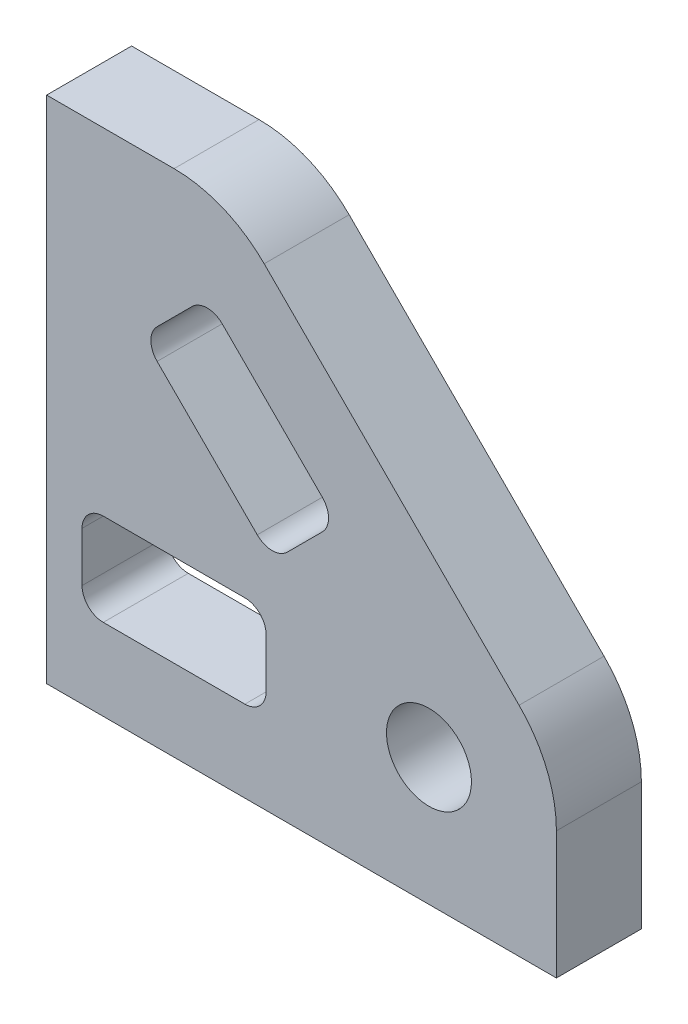
ISO-10303-21;
HEADER;
FILE_DESCRIPTION(('STEP AP214'),'2;1');
FILE_NAME('part.step','',(''),(''),'','','');
FILE_SCHEMA(('AUTOMOTIVE_DESIGN { 1 0 10303 214 1 1 1 1 }'));
ENDSEC;
DATA;
#1=APPLICATION_CONTEXT('core data for automotive mechanical design processes');
#2=APPLICATION_PROTOCOL_DEFINITION('international standard','automotive_design',2000,#1);
#3=PRODUCT_CONTEXT('',#1,'mechanical');
#4=PRODUCT('Part','Part','',(#3));
#5=PRODUCT_RELATED_PRODUCT_CATEGORY('part','',(#4));
#6=PRODUCT_DEFINITION_FORMATION('','',#4);
#7=PRODUCT_DEFINITION_CONTEXT('part definition',#1,'design');
#8=PRODUCT_DEFINITION('design','',#6,#7);
#9=PRODUCT_DEFINITION_SHAPE('','',#8);
#10=(LENGTH_UNIT() NAMED_UNIT(*) SI_UNIT(.MILLI.,.METRE.));
#11=(NAMED_UNIT(*) PLANE_ANGLE_UNIT() SI_UNIT($,.RADIAN.));
#12=(NAMED_UNIT(*) SI_UNIT($,.STERADIAN.) SOLID_ANGLE_UNIT());
#13=UNCERTAINTY_MEASURE_WITH_UNIT(LENGTH_MEASURE(1.E-05),#10,'distance_accuracy_value','');
#14=(GEOMETRIC_REPRESENTATION_CONTEXT(3) GLOBAL_UNCERTAINTY_ASSIGNED_CONTEXT((#13)) GLOBAL_UNIT_ASSIGNED_CONTEXT((#10,
#11,#12)) REPRESENTATION_CONTEXT('',''));
#15=CARTESIAN_POINT('',(0.,0.,0.));
#16=DIRECTION('',(0.,0.,1.));
#17=DIRECTION('',(1.,0.,0.));
#18=AXIS2_PLACEMENT_3D('',#15,#16,#17);
#19=CARTESIAN_POINT('',(176.3421335095,180.323953208921,3.));
#20=DIRECTION('',(0.,0.,1.));
#21=DIRECTION('',(1.,0.,0.));
#22=AXIS2_PLACEMENT_3D('',#19,#20,#21);
#23=PLANE('',#22);
#24=DIRECTION('',(-0.707106781186545,0.70710678118655,0.));
#25=VECTOR('',#24,1.);
#26=CARTESIAN_POINT('',(169.0413489818,189.9286703042,3.));
#27=LINE('',#26,#25);
#28=CARTESIAN_POINT('',(172.5768828877,186.3931363983,3.));
#29=VERTEX_POINT('',#28);
#30=CARTESIAN_POINT('',(169.0413489818,189.9286703042,3.));
#31=VERTEX_POINT('',#30);
#32=EDGE_CURVE('E196',#29,#31,#27,.T.);
#33=ORIENTED_EDGE('',*,*,#32,.F.);
#34=CARTESIAN_POINT('',(172.04655280182,185.8628063124,3.));
#35=DIRECTION('',(0.,0.,1.));
#36=DIRECTION('',(1.,0.,0.));
#37=AXIS2_PLACEMENT_3D('',#34,#35,#36);
#38=CIRCLE('',#37,0.749999999999997);
#39=CARTESIAN_POINT('',(172.5768828877,185.3324762265,3.));
#40=VERTEX_POINT('',#39);
#41=EDGE_CURVE('E188',#40,#29,#38,.T.);
#42=ORIENTED_EDGE('',*,*,#41,.F.);
#43=DIRECTION('',(0.707106781186548,0.707106781186548,0.));
#44=VECTOR('',#43,1.);
#45=CARTESIAN_POINT('',(172.5768828877,185.3324762265,3.));
#46=LINE('',#45,#44);
#47=CARTESIAN_POINT('',(171.3394460206,184.0950393594,3.));
#48=VERTEX_POINT('',#47);
#49=EDGE_CURVE('E223',#48,#40,#46,.T.);
#50=ORIENTED_EDGE('',*,*,#49,.F.);
#51=CARTESIAN_POINT('',(170.80911593475,184.62536944533,3.));
#52=DIRECTION('',(0.,0.,1.));
#53=DIRECTION('',(1.,0.,0.));
#54=AXIS2_PLACEMENT_3D('',#51,#52,#53);
#55=CIRCLE('',#54,0.749999999999997);
#56=CARTESIAN_POINT('',(170.2787858489,184.0950393594,3.));
#57=VERTEX_POINT('',#56);
#58=EDGE_CURVE('E221',#57,#48,#55,.T.);
#59=ORIENTED_EDGE('',*,*,#58,.F.);
#60=DIRECTION('',(0.707106781186545,-0.70710678118655,0.));
#61=VECTOR('',#60,1.);
#62=CARTESIAN_POINT('',(170.2787858489,184.0950393594,3.));
#63=LINE('',#62,#61);
#64=CARTESIAN_POINT('',(166.7432519429,187.6305732654,3.));
#65=VERTEX_POINT('',#64);
#66=EDGE_CURVE('E219',#65,#57,#63,.T.);
#67=ORIENTED_EDGE('',*,*,#66,.F.);
#68=CARTESIAN_POINT('',(167.27358202883,188.16090335125,3.));
#69=DIRECTION('',(0.,0.,1.));
#70=DIRECTION('',(1.,0.,0.));
#71=AXIS2_PLACEMENT_3D('',#68,#69,#70);
#72=CIRCLE('',#71,0.750000000000017);
#73=CARTESIAN_POINT('',(166.7432519429,188.6912334371,3.));
#74=VERTEX_POINT('',#73);
#75=EDGE_CURVE('E217',#74,#65,#72,.T.);
#76=ORIENTED_EDGE('',*,*,#75,.F.);
#77=DIRECTION('',(-0.70710678118654,-0.707106781186555,0.));
#78=VECTOR('',#77,1.);
#79=CARTESIAN_POINT('',(166.7432519429,188.6912334371,3.));
#80=LINE('',#79,#78);
#81=CARTESIAN_POINT('',(167.98068881,189.9286703042,3.));
#82=VERTEX_POINT('',#81);
#83=EDGE_CURVE('E212',#82,#74,#80,.T.);
#84=ORIENTED_EDGE('',*,*,#83,.F.);
#85=CARTESIAN_POINT('',(168.5110188959,189.39834021832,3.));
#86=DIRECTION('',(0.,0.,1.));
#87=DIRECTION('',(1.,0.,0.));
#88=AXIS2_PLACEMENT_3D('',#85,#86,#87);
#89=CIRCLE('',#88,0.750000000000007);
#90=EDGE_CURVE('E210',#31,#82,#89,.T.);
#91=ORIENTED_EDGE('',*,*,#90,.F.);
#92=EDGE_LOOP('',(#33,#42,#50,#59,#67,#76,#84,#91));
#93=FACE_BOUND('',#92,.T.);
#94=CARTESIAN_POINT('',(176.3421335095,180.323953208921,3.));
#95=DIRECTION('',(0.,0.,1.));
#96=DIRECTION('',(1.,0.,0.));
#97=AXIS2_PLACEMENT_3D('',#94,#95,#96);
#98=CIRCLE('',#97,4.50000000000001);
#99=CARTESIAN_POINT('',(180.8421335095,180.323953209,3.));
#100=VERTEX_POINT('',#99);
#101=CARTESIAN_POINT('',(179.5241140248,183.5059337243,3.));
#102=VERTEX_POINT('',#101);
#103=EDGE_CURVE('E315',#100,#102,#98,.T.);
#104=ORIENTED_EDGE('',*,*,#103,.T.);
#105=DIRECTION('',(-0.707106781186548,0.707106781186548,0.));
#106=VECTOR('',#105,1.);
#107=CARTESIAN_POINT('',(179.5241140248,183.5059337243,3.));
#108=LINE('',#107,#106);
#109=CARTESIAN_POINT('',(170.5241140248,192.5059337243,3.));
#110=VERTEX_POINT('',#109);
#111=EDGE_CURVE('E318',#102,#110,#108,.T.);
#112=ORIENTED_EDGE('',*,*,#111,.T.);
#113=CARTESIAN_POINT('',(167.342133509421,189.323953209,3.));
#114=DIRECTION('',(0.,0.,1.));
#115=DIRECTION('',(1.,0.,0.));
#116=AXIS2_PLACEMENT_3D('',#113,#114,#115);
#117=CIRCLE('',#116,4.5);
#118=CARTESIAN_POINT('',(167.3421335095,193.823953209,3.));
#119=VERTEX_POINT('',#118);
#120=EDGE_CURVE('E321',#110,#119,#117,.T.);
#121=ORIENTED_EDGE('',*,*,#120,.T.);
#122=DIRECTION('',(-1.,0.,0.));
#123=VECTOR('',#122,1.);
#124=CARTESIAN_POINT('',(167.3421335095,193.823953209,3.));
#125=LINE('',#124,#123);
#126=CARTESIAN_POINT('',(162.8421335095,193.823953209,3.));
#127=VERTEX_POINT('',#126);
#128=EDGE_CURVE('E323',#119,#127,#125,.T.);
#129=ORIENTED_EDGE('',*,*,#128,.T.);
#130=DIRECTION('',(0.,-1.,0.));
#131=VECTOR('',#130,1.);
#132=CARTESIAN_POINT('',(162.8421335095,193.823953209,3.));
#133=LINE('',#132,#131);
#134=CARTESIAN_POINT('',(162.8421335095,175.823953209,3.));
#135=VERTEX_POINT('',#134);
#136=EDGE_CURVE('E325',#127,#135,#133,.T.);
#137=ORIENTED_EDGE('',*,*,#136,.T.);
#138=DIRECTION('',(1.,0.,0.));
#139=VECTOR('',#138,1.);
#140=CARTESIAN_POINT('',(180.8421335095,175.823953209,3.));
#141=LINE('',#140,#139);
#142=CARTESIAN_POINT('',(180.8421335095,175.823953209,3.));
#143=VERTEX_POINT('',#142);
#144=EDGE_CURVE('E327',#135,#143,#141,.T.);
#145=ORIENTED_EDGE('',*,*,#144,.T.);
#146=DIRECTION('',(0.,1.,0.));
#147=VECTOR('',#146,1.);
#148=CARTESIAN_POINT('',(180.8421335095,180.323953209,3.));
#149=LINE('',#148,#147);
#150=EDGE_CURVE('E329',#143,#100,#149,.T.);
#151=ORIENTED_EDGE('',*,*,#150,.T.);
#152=EDGE_LOOP('',(#104,#112,#121,#129,#137,#145,#151));
#153=FACE_BOUND('',#152,.T.);
#154=DIRECTION('',(-1.,0.,0.));
#155=VECTOR('',#154,1.);
#156=CARTESIAN_POINT('',(164.8421335095,181.948953209,3.));
#157=LINE('',#156,#155);
#158=CARTESIAN_POINT('',(169.8421335095,181.948953209,3.));
#159=VERTEX_POINT('',#158);
#160=CARTESIAN_POINT('',(164.8421335095,181.948953209,3.));
#161=VERTEX_POINT('',#160);
#162=EDGE_CURVE('E258',#159,#161,#157,.T.);
#163=ORIENTED_EDGE('',*,*,#162,.F.);
#164=CARTESIAN_POINT('',(169.8421335095,181.198953209,3.));
#165=DIRECTION('',(0.,0.,1.));
#166=DIRECTION('',(1.,0.,0.));
#167=AXIS2_PLACEMENT_3D('',#164,#165,#166);
#168=CIRCLE('',#167,0.750000000000001);
#169=CARTESIAN_POINT('',(170.5921335095,181.198953209,3.));
#170=VERTEX_POINT('',#169);
#171=EDGE_CURVE('E256',#170,#159,#168,.T.);
#172=ORIENTED_EDGE('',*,*,#171,.F.);
#173=DIRECTION('',(0.,1.,0.));
#174=VECTOR('',#173,1.);
#175=CARTESIAN_POINT('',(170.5921335095,181.198953209,3.));
#176=LINE('',#175,#174);
#177=CARTESIAN_POINT('',(170.5921335095,179.448953209,3.));
#178=VERTEX_POINT('',#177);
#179=EDGE_CURVE('E272',#178,#170,#176,.T.);
#180=ORIENTED_EDGE('',*,*,#179,.F.);
#181=CARTESIAN_POINT('',(169.8421335095,179.448953209,3.));
#182=DIRECTION('',(0.,0.,1.));
#183=DIRECTION('',(1.,0.,0.));
#184=AXIS2_PLACEMENT_3D('',#181,#182,#183);
#185=CIRCLE('',#184,0.750000000000001);
#186=CARTESIAN_POINT('',(169.8421335095,178.698953209,3.));
#187=VERTEX_POINT('',#186);
#188=EDGE_CURVE('E269',#187,#178,#185,.T.);
#189=ORIENTED_EDGE('',*,*,#188,.F.);
#190=DIRECTION('',(1.,0.,0.));
#191=VECTOR('',#190,1.);
#192=CARTESIAN_POINT('',(169.8421335095,178.698953209,3.));
#193=LINE('',#192,#191);
#194=CARTESIAN_POINT('',(164.8421335095,178.698953209,3.));
#195=VERTEX_POINT('',#194);
#196=EDGE_CURVE('E267',#195,#187,#193,.T.);
#197=ORIENTED_EDGE('',*,*,#196,.F.);
#198=CARTESIAN_POINT('',(164.8421335095,179.448953209,3.));
#199=DIRECTION('',(0.,0.,1.));
#200=DIRECTION('',(1.,0.,0.));
#201=AXIS2_PLACEMENT_3D('',#198,#199,#200);
#202=CIRCLE('',#201,0.750000000000001);
#203=CARTESIAN_POINT('',(164.0921335095,179.448953209,3.));
#204=VERTEX_POINT('',#203);
#205=EDGE_CURVE('E265',#204,#195,#202,.T.);
#206=ORIENTED_EDGE('',*,*,#205,.F.);
#207=DIRECTION('',(0.,-1.,0.));
#208=VECTOR('',#207,1.);
#209=CARTESIAN_POINT('',(164.0921335095,179.448953209,3.));
#210=LINE('',#209,#208);
#211=CARTESIAN_POINT('',(164.0921335095,181.198953209,3.));
#212=VERTEX_POINT('',#211);
#213=EDGE_CURVE('E263',#212,#204,#210,.T.);
#214=ORIENTED_EDGE('',*,*,#213,.F.);
#215=CARTESIAN_POINT('',(164.8421335095,181.198953209,3.));
#216=DIRECTION('',(0.,0.,1.));
#217=DIRECTION('',(1.,0.,0.));
#218=AXIS2_PLACEMENT_3D('',#215,#216,#217);
#219=CIRCLE('',#218,0.750000000000001);
#220=EDGE_CURVE('E261',#161,#212,#219,.T.);
#221=ORIENTED_EDGE('',*,*,#220,.F.);
#222=EDGE_LOOP('',(#163,#172,#180,#189,#197,#206,#214,#221));
#223=FACE_BOUND('',#222,.T.);
#224=CARTESIAN_POINT('',(176.3421335095,180.323953208921,3.));
#225=DIRECTION('',(0.,0.,1.));
#226=DIRECTION('',(1.,0.,0.));
#227=AXIS2_PLACEMENT_3D('',#224,#225,#226);
#228=CIRCLE('',#227,1.5);
#229=CARTESIAN_POINT('',(177.8421335095,180.323953208921,3.));
#230=VERTEX_POINT('',#229);
#231=EDGE_CURVE('E226',#230,#230,#228,.T.);
#232=ORIENTED_EDGE('',*,*,#231,.F.);
#233=EDGE_LOOP('',(#232));
#234=FACE_BOUND('',#233,.T.);
#235=ADVANCED_FACE('F33',(#93,#153,#223,#234),#23,.T.);
#236=CARTESIAN_POINT('',(176.3421335095,180.323953208921,0.));
#237=DIRECTION('',(0.,0.,1.));
#238=DIRECTION('',(1.,0.,0.));
#239=AXIS2_PLACEMENT_3D('',#236,#237,#238);
#240=PLANE('',#239);
#241=CARTESIAN_POINT('',(172.04655280182,185.8628063124,0.));
#242=DIRECTION('',(0.,0.,1.));
#243=DIRECTION('',(1.,0.,0.));
#244=AXIS2_PLACEMENT_3D('',#241,#242,#243);
#245=CIRCLE('',#244,0.749999999999997);
#246=CARTESIAN_POINT('',(172.5768828877,185.3324762265,0.));
#247=VERTEX_POINT('',#246);
#248=CARTESIAN_POINT('',(172.5768828877,186.3931363983,0.));
#249=VERTEX_POINT('',#248);
#250=EDGE_CURVE('E56',#247,#249,#245,.T.);
#251=ORIENTED_EDGE('',*,*,#250,.T.);
#252=DIRECTION('',(-0.707106781186545,0.70710678118655,0.));
#253=VECTOR('',#252,1.);
#254=CARTESIAN_POINT('',(169.0413489818,189.9286703042,0.));
#255=LINE('',#254,#253);
#256=CARTESIAN_POINT('',(169.0413489818,189.9286703042,0.));
#257=VERTEX_POINT('',#256);
#258=EDGE_CURVE('E203',#249,#257,#255,.T.);
#259=ORIENTED_EDGE('',*,*,#258,.T.);
#260=CARTESIAN_POINT('',(168.5110188959,189.39834021832,0.));
#261=DIRECTION('',(0.,0.,1.));
#262=DIRECTION('',(1.,0.,0.));
#263=AXIS2_PLACEMENT_3D('',#260,#261,#262);
#264=CIRCLE('',#263,0.750000000000007);
#265=CARTESIAN_POINT('',(167.98068881,189.9286703042,0.));
#266=VERTEX_POINT('',#265);
#267=EDGE_CURVE('E228',#257,#266,#264,.T.);
#268=ORIENTED_EDGE('',*,*,#267,.T.);
#269=DIRECTION('',(-0.70710678118654,-0.707106781186555,0.));
#270=VECTOR('',#269,1.);
#271=CARTESIAN_POINT('',(166.7432519429,188.6912334371,0.));
#272=LINE('',#271,#270);
#273=CARTESIAN_POINT('',(166.7432519429,188.6912334371,0.));
#274=VERTEX_POINT('',#273);
#275=EDGE_CURVE('E231',#266,#274,#272,.T.);
#276=ORIENTED_EDGE('',*,*,#275,.T.);
#277=CARTESIAN_POINT('',(167.27358202883,188.16090335125,0.));
#278=DIRECTION('',(0.,0.,1.));
#279=DIRECTION('',(1.,0.,0.));
#280=AXIS2_PLACEMENT_3D('',#277,#278,#279);
#281=CIRCLE('',#280,0.750000000000017);
#282=CARTESIAN_POINT('',(166.7432519429,187.6305732654,0.));
#283=VERTEX_POINT('',#282);
#284=EDGE_CURVE('E234',#274,#283,#281,.T.);
#285=ORIENTED_EDGE('',*,*,#284,.T.);
#286=DIRECTION('',(0.707106781186545,-0.70710678118655,0.));
#287=VECTOR('',#286,1.);
#288=CARTESIAN_POINT('',(170.2787858489,184.0950393594,0.));
#289=LINE('',#288,#287);
#290=CARTESIAN_POINT('',(170.2787858489,184.0950393594,0.));
#291=VERTEX_POINT('',#290);
#292=EDGE_CURVE('E237',#283,#291,#289,.T.);
#293=ORIENTED_EDGE('',*,*,#292,.T.);
#294=CARTESIAN_POINT('',(170.80911593475,184.62536944533,0.));
#295=DIRECTION('',(0.,0.,1.));
#296=DIRECTION('',(1.,0.,0.));
#297=AXIS2_PLACEMENT_3D('',#294,#295,#296);
#298=CIRCLE('',#297,0.749999999999997);
#299=CARTESIAN_POINT('',(171.3394460206,184.0950393594,0.));
#300=VERTEX_POINT('',#299);
#301=EDGE_CURVE('E240',#291,#300,#298,.T.);
#302=ORIENTED_EDGE('',*,*,#301,.T.);
#303=DIRECTION('',(0.707106781186548,0.707106781186548,0.));
#304=VECTOR('',#303,1.);
#305=CARTESIAN_POINT('',(172.5768828877,185.3324762265,0.));
#306=LINE('',#305,#304);
#307=EDGE_CURVE('E197',#300,#247,#306,.T.);
#308=ORIENTED_EDGE('',*,*,#307,.T.);
#309=EDGE_LOOP('',(#251,#259,#268,#276,#285,#293,#302,#308));
#310=FACE_BOUND('',#309,.T.);
#311=CARTESIAN_POINT('',(176.3421335095,180.323953208921,0.));
#312=DIRECTION('',(0.,0.,1.));
#313=DIRECTION('',(1.,0.,0.));
#314=AXIS2_PLACEMENT_3D('',#311,#312,#313);
#315=CIRCLE('',#314,4.50000000000001);
#316=CARTESIAN_POINT('',(180.8421335095,180.323953209,0.));
#317=VERTEX_POINT('',#316);
#318=CARTESIAN_POINT('',(179.5241140248,183.5059337243,0.));
#319=VERTEX_POINT('',#318);
#320=EDGE_CURVE('E314',#317,#319,#315,.T.);
#321=ORIENTED_EDGE('',*,*,#320,.F.);
#322=DIRECTION('',(0.,1.,0.));
#323=VECTOR('',#322,1.);
#324=CARTESIAN_POINT('',(180.8421335095,180.323953209,0.));
#325=LINE('',#324,#323);
#326=CARTESIAN_POINT('',(180.8421335095,175.823953209,0.));
#327=VERTEX_POINT('',#326);
#328=EDGE_CURVE('E319',#327,#317,#325,.T.);
#329=ORIENTED_EDGE('',*,*,#328,.F.);
#330=DIRECTION('',(1.,0.,0.));
#331=VECTOR('',#330,1.);
#332=CARTESIAN_POINT('',(180.8421335095,175.823953209,0.));
#333=LINE('',#332,#331);
#334=CARTESIAN_POINT('',(162.8421335095,175.823953209,0.));
#335=VERTEX_POINT('',#334);
#336=EDGE_CURVE('E342',#335,#327,#333,.T.);
#337=ORIENTED_EDGE('',*,*,#336,.F.);
#338=DIRECTION('',(0.,-1.,0.));
#339=VECTOR('',#338,1.);
#340=CARTESIAN_POINT('',(162.8421335095,193.823953209,0.));
#341=LINE('',#340,#339);
#342=CARTESIAN_POINT('',(162.8421335095,193.823953209,0.));
#343=VERTEX_POINT('',#342);
#344=EDGE_CURVE('E340',#343,#335,#341,.T.);
#345=ORIENTED_EDGE('',*,*,#344,.F.);
#346=DIRECTION('',(-1.,0.,0.));
#347=VECTOR('',#346,1.);
#348=CARTESIAN_POINT('',(167.3421335095,193.823953209,0.));
#349=LINE('',#348,#347);
#350=CARTESIAN_POINT('',(167.3421335095,193.823953209,0.));
#351=VERTEX_POINT('',#350);
#352=EDGE_CURVE('E338',#351,#343,#349,.T.);
#353=ORIENTED_EDGE('',*,*,#352,.F.);
#354=CARTESIAN_POINT('',(167.342133509421,189.323953209,0.));
#355=DIRECTION('',(0.,0.,1.));
#356=DIRECTION('',(1.,0.,0.));
#357=AXIS2_PLACEMENT_3D('',#354,#355,#356);
#358=CIRCLE('',#357,4.5);
#359=CARTESIAN_POINT('',(170.5241140248,192.5059337243,0.));
#360=VERTEX_POINT('',#359);
#361=EDGE_CURVE('E336',#360,#351,#358,.T.);
#362=ORIENTED_EDGE('',*,*,#361,.F.);
#363=DIRECTION('',(-0.707106781186548,0.707106781186548,0.));
#364=VECTOR('',#363,1.);
#365=CARTESIAN_POINT('',(179.5241140248,183.5059337243,0.));
#366=LINE('',#365,#364);
#367=EDGE_CURVE('E334',#319,#360,#366,.T.);
#368=ORIENTED_EDGE('',*,*,#367,.F.);
#369=EDGE_LOOP('',(#321,#329,#337,#345,#353,#362,#368));
#370=FACE_BOUND('',#369,.T.);
#371=CARTESIAN_POINT('',(169.8421335095,181.198953209,0.));
#372=DIRECTION('',(0.,0.,1.));
#373=DIRECTION('',(1.,0.,0.));
#374=AXIS2_PLACEMENT_3D('',#371,#372,#373);
#375=CIRCLE('',#374,0.750000000000001);
#376=CARTESIAN_POINT('',(170.5921335095,181.198953209,0.));
#377=VERTEX_POINT('',#376);
#378=CARTESIAN_POINT('',(169.8421335095,181.948953209,0.));
#379=VERTEX_POINT('',#378);
#380=EDGE_CURVE('E204',#377,#379,#375,.T.);
#381=ORIENTED_EDGE('',*,*,#380,.T.);
#382=DIRECTION('',(-1.,0.,0.));
#383=VECTOR('',#382,1.);
#384=CARTESIAN_POINT('',(164.8421335095,181.948953209,0.));
#385=LINE('',#384,#383);
#386=CARTESIAN_POINT('',(164.8421335095,181.948953209,0.));
#387=VERTEX_POINT('',#386);
#388=EDGE_CURVE('E277',#379,#387,#385,.T.);
#389=ORIENTED_EDGE('',*,*,#388,.T.);
#390=CARTESIAN_POINT('',(164.8421335095,181.198953209,0.));
#391=DIRECTION('',(0.,0.,1.));
#392=DIRECTION('',(1.,0.,0.));
#393=AXIS2_PLACEMENT_3D('',#390,#391,#392);
#394=CIRCLE('',#393,0.750000000000001);
#395=CARTESIAN_POINT('',(164.0921335095,181.198953209,0.));
#396=VERTEX_POINT('',#395);
#397=EDGE_CURVE('E280',#387,#396,#394,.T.);
#398=ORIENTED_EDGE('',*,*,#397,.T.);
#399=DIRECTION('',(0.,-1.,0.));
#400=VECTOR('',#399,1.);
#401=CARTESIAN_POINT('',(164.0921335095,179.448953209,0.));
#402=LINE('',#401,#400);
#403=CARTESIAN_POINT('',(164.0921335095,179.448953209,0.));
#404=VERTEX_POINT('',#403);
#405=EDGE_CURVE('E283',#396,#404,#402,.T.);
#406=ORIENTED_EDGE('',*,*,#405,.T.);
#407=CARTESIAN_POINT('',(164.8421335095,179.448953209,0.));
#408=DIRECTION('',(0.,0.,1.));
#409=DIRECTION('',(1.,0.,0.));
#410=AXIS2_PLACEMENT_3D('',#407,#408,#409);
#411=CIRCLE('',#410,0.750000000000001);
#412=CARTESIAN_POINT('',(164.8421335095,178.698953209,0.));
#413=VERTEX_POINT('',#412);
#414=EDGE_CURVE('E286',#404,#413,#411,.T.);
#415=ORIENTED_EDGE('',*,*,#414,.T.);
#416=DIRECTION('',(1.,0.,0.));
#417=VECTOR('',#416,1.);
#418=CARTESIAN_POINT('',(169.8421335095,178.698953209,0.));
#419=LINE('',#418,#417);
#420=CARTESIAN_POINT('',(169.8421335095,178.698953209,0.));
#421=VERTEX_POINT('',#420);
#422=EDGE_CURVE('E289',#413,#421,#419,.T.);
#423=ORIENTED_EDGE('',*,*,#422,.T.);
#424=CARTESIAN_POINT('',(169.8421335095,179.448953209,0.));
#425=DIRECTION('',(0.,0.,1.));
#426=DIRECTION('',(1.,0.,0.));
#427=AXIS2_PLACEMENT_3D('',#424,#425,#426);
#428=CIRCLE('',#427,0.750000000000001);
#429=CARTESIAN_POINT('',(170.5921335095,179.448953209,0.));
#430=VERTEX_POINT('',#429);
#431=EDGE_CURVE('E292',#421,#430,#428,.T.);
#432=ORIENTED_EDGE('',*,*,#431,.T.);
#433=DIRECTION('',(0.,1.,0.));
#434=VECTOR('',#433,1.);
#435=CARTESIAN_POINT('',(170.5921335095,181.198953209,0.));
#436=LINE('',#435,#434);
#437=EDGE_CURVE('E259',#430,#377,#436,.T.);
#438=ORIENTED_EDGE('',*,*,#437,.T.);
#439=EDGE_LOOP('',(#381,#389,#398,#406,#415,#423,#432,#438));
#440=FACE_BOUND('',#439,.T.);
#441=CARTESIAN_POINT('',(176.3421335095,180.323953208921,0.));
#442=DIRECTION('',(0.,0.,1.));
#443=DIRECTION('',(1.,0.,0.));
#444=AXIS2_PLACEMENT_3D('',#441,#442,#443);
#445=CIRCLE('',#444,1.5);
#446=CARTESIAN_POINT('',(177.8421335095,180.323953208921,0.));
#447=VERTEX_POINT('',#446);
#448=EDGE_CURVE('E480',#447,#447,#445,.T.);
#449=ORIENTED_EDGE('',*,*,#448,.T.);
#450=EDGE_LOOP('',(#449));
#451=FACE_BOUND('',#450,.T.);
#452=ADVANCED_FACE('F369',(#310,#370,#440,#451),#240,.F.);
#453=CARTESIAN_POINT('',(176.3421335095,180.323953208921,3.));
#454=DIRECTION('',(0.,0.,-1.));
#455=DIRECTION('',(-1.,0.,0.));
#456=AXIS2_PLACEMENT_3D('',#453,#454,#455);
#457=CYLINDRICAL_SURFACE('',#456,4.50000000000001);
#458=ORIENTED_EDGE('',*,*,#320,.T.);
#459=DIRECTION('',(0.,0.,-1.));
#460=VECTOR('',#459,1.);
#461=CARTESIAN_POINT('',(179.5241140248,183.5059337243,3.));
#462=LINE('',#461,#460);
#463=EDGE_CURVE('E11',#102,#319,#462,.T.);
#464=ORIENTED_EDGE('',*,*,#463,.F.);
#465=ORIENTED_EDGE('',*,*,#103,.F.);
#466=DIRECTION('',(0.,0.,-1.));
#467=VECTOR('',#466,1.);
#468=CARTESIAN_POINT('',(180.8421335095,180.323953209,3.));
#469=LINE('',#468,#467);
#470=EDGE_CURVE('E331',#100,#317,#469,.T.);
#471=ORIENTED_EDGE('',*,*,#470,.T.);
#472=EDGE_LOOP('',(#458,#464,#465,#471));
#473=FACE_BOUND('',#472,.T.);
#474=ADVANCED_FACE('F35',(#473),#457,.T.);
#475=CARTESIAN_POINT('',(179.5241140248,183.5059337243,3.));
#476=DIRECTION('',(-0.707106781186547,-0.707106781186547,0.));
#477=DIRECTION('',(0.707106781186548,-0.707106781186548,0.));
#478=AXIS2_PLACEMENT_3D('',#475,#476,#477);
#479=PLANE('',#478);
#480=ORIENTED_EDGE('',*,*,#367,.T.);
#481=DIRECTION('',(0.,0.,-1.));
#482=VECTOR('',#481,1.);
#483=CARTESIAN_POINT('',(170.5241140248,192.5059337243,3.));
#484=LINE('',#483,#482);
#485=EDGE_CURVE('E41',#110,#360,#484,.T.);
#486=ORIENTED_EDGE('',*,*,#485,.F.);
#487=ORIENTED_EDGE('',*,*,#111,.F.);
#488=ORIENTED_EDGE('',*,*,#463,.T.);
#489=EDGE_LOOP('',(#480,#486,#487,#488));
#490=FACE_BOUND('',#489,.T.);
#491=ADVANCED_FACE('F386',(#490),#479,.F.);
#492=CARTESIAN_POINT('',(167.342133509421,189.323953209,3.));
#493=DIRECTION('',(0.,0.,-1.));
#494=DIRECTION('',(-1.,0.,0.));
#495=AXIS2_PLACEMENT_3D('',#492,#493,#494);
#496=CYLINDRICAL_SURFACE('',#495,4.5);
#497=ORIENTED_EDGE('',*,*,#361,.T.);
#498=DIRECTION('',(0.,0.,-1.));
#499=VECTOR('',#498,1.);
#500=CARTESIAN_POINT('',(167.3421335095,193.823953209,3.));
#501=LINE('',#500,#499);
#502=EDGE_CURVE('E356',#119,#351,#501,.T.);
#503=ORIENTED_EDGE('',*,*,#502,.F.);
#504=ORIENTED_EDGE('',*,*,#120,.F.);
#505=ORIENTED_EDGE('',*,*,#485,.T.);
#506=EDGE_LOOP('',(#497,#503,#504,#505));
#507=FACE_BOUND('',#506,.T.);
#508=ADVANCED_FACE('F363',(#507),#496,.T.);
#509=CARTESIAN_POINT('',(167.3421335095,193.823953209,3.));
#510=DIRECTION('',(0.,-1.,0.));
#511=DIRECTION('',(0.,0.,-1.));
#512=AXIS2_PLACEMENT_3D('',#509,#510,#511);
#513=PLANE('',#512);
#514=ORIENTED_EDGE('',*,*,#352,.T.);
#515=DIRECTION('',(0.,0.,-1.));
#516=VECTOR('',#515,1.);
#517=CARTESIAN_POINT('',(162.8421335095,193.823953209,3.));
#518=LINE('',#517,#516);
#519=EDGE_CURVE('E353',#127,#343,#518,.T.);
#520=ORIENTED_EDGE('',*,*,#519,.F.);
#521=ORIENTED_EDGE('',*,*,#128,.F.);
#522=ORIENTED_EDGE('',*,*,#502,.T.);
#523=EDGE_LOOP('',(#514,#520,#521,#522));
#524=FACE_BOUND('',#523,.T.);
#525=ADVANCED_FACE('F375',(#524),#513,.F.);
#526=CARTESIAN_POINT('',(162.8421335095,193.823953209,3.));
#527=DIRECTION('',(1.,0.,0.));
#528=DIRECTION('',(0.,0.,-1.));
#529=AXIS2_PLACEMENT_3D('',#526,#527,#528);
#530=PLANE('',#529);
#531=ORIENTED_EDGE('',*,*,#344,.T.);
#532=DIRECTION('',(0.,0.,-1.));
#533=VECTOR('',#532,1.);
#534=CARTESIAN_POINT('',(162.8421335095,175.823953209,3.));
#535=LINE('',#534,#533);
#536=EDGE_CURVE('E350',#135,#335,#535,.T.);
#537=ORIENTED_EDGE('',*,*,#536,.F.);
#538=ORIENTED_EDGE('',*,*,#136,.F.);
#539=ORIENTED_EDGE('',*,*,#519,.T.);
#540=EDGE_LOOP('',(#531,#537,#538,#539));
#541=FACE_BOUND('',#540,.T.);
#542=ADVANCED_FACE('F379',(#541),#530,.F.);
#543=CARTESIAN_POINT('',(180.8421335095,175.823953209,3.));
#544=DIRECTION('',(0.,1.,0.));
#545=DIRECTION('',(0.,0.,1.));
#546=AXIS2_PLACEMENT_3D('',#543,#544,#545);
#547=PLANE('',#546);
#548=ORIENTED_EDGE('',*,*,#336,.T.);
#549=DIRECTION('',(0.,0.,-1.));
#550=VECTOR('',#549,1.);
#551=CARTESIAN_POINT('',(180.8421335095,175.823953209,3.));
#552=LINE('',#551,#550);
#553=EDGE_CURVE('E347',#143,#327,#552,.T.);
#554=ORIENTED_EDGE('',*,*,#553,.F.);
#555=ORIENTED_EDGE('',*,*,#144,.F.);
#556=ORIENTED_EDGE('',*,*,#536,.T.);
#557=EDGE_LOOP('',(#548,#554,#555,#556));
#558=FACE_BOUND('',#557,.T.);
#559=ADVANCED_FACE('F394',(#558),#547,.F.);
#560=CARTESIAN_POINT('',(180.8421335095,180.323953209,3.));
#561=DIRECTION('',(-1.,0.,0.));
#562=DIRECTION('',(0.,0.,1.));
#563=AXIS2_PLACEMENT_3D('',#560,#561,#562);
#564=PLANE('',#563);
#565=ORIENTED_EDGE('',*,*,#328,.T.);
#566=ORIENTED_EDGE('',*,*,#470,.F.);
#567=ORIENTED_EDGE('',*,*,#150,.F.);
#568=ORIENTED_EDGE('',*,*,#553,.T.);
#569=EDGE_LOOP('',(#565,#566,#567,#568));
#570=FACE_BOUND('',#569,.T.);
#571=ADVANCED_FACE('F391',(#570),#564,.F.);
#572=CARTESIAN_POINT('',(169.8421335095,181.198953209,3.));
#573=DIRECTION('',(0.,0.,-1.));
#574=DIRECTION('',(-1.,0.,0.));
#575=AXIS2_PLACEMENT_3D('',#572,#573,#574);
#576=CYLINDRICAL_SURFACE('',#575,0.750000000000001);
#577=ORIENTED_EDGE('',*,*,#380,.F.);
#578=DIRECTION('',(0.,0.,-1.));
#579=VECTOR('',#578,1.);
#580=CARTESIAN_POINT('',(170.5921335095,181.198953209,3.));
#581=LINE('',#580,#579);
#582=EDGE_CURVE('E274',#170,#377,#581,.T.);
#583=ORIENTED_EDGE('',*,*,#582,.F.);
#584=ORIENTED_EDGE('',*,*,#171,.T.);
#585=DIRECTION('',(0.,0.,-1.));
#586=VECTOR('',#585,1.);
#587=CARTESIAN_POINT('',(169.8421335095,181.948953209,3.));
#588=LINE('',#587,#586);
#589=EDGE_CURVE('E311',#159,#379,#588,.T.);
#590=ORIENTED_EDGE('',*,*,#589,.T.);
#591=EDGE_LOOP('',(#577,#583,#584,#590));
#592=FACE_BOUND('',#591,.T.);
#593=ADVANCED_FACE('F401',(#592),#576,.F.);
#594=CARTESIAN_POINT('',(164.8421335095,181.948953209,3.));
#595=DIRECTION('',(0.,-1.,0.));
#596=DIRECTION('',(0.,0.,-1.));
#597=AXIS2_PLACEMENT_3D('',#594,#595,#596);
#598=PLANE('',#597);
#599=ORIENTED_EDGE('',*,*,#388,.F.);
#600=ORIENTED_EDGE('',*,*,#589,.F.);
#601=ORIENTED_EDGE('',*,*,#162,.T.);
#602=DIRECTION('',(0.,0.,-1.));
#603=VECTOR('',#602,1.);
#604=CARTESIAN_POINT('',(164.8421335095,181.948953209,3.));
#605=LINE('',#604,#603);
#606=EDGE_CURVE('E309',#161,#387,#605,.T.);
#607=ORIENTED_EDGE('',*,*,#606,.T.);
#608=EDGE_LOOP('',(#599,#600,#601,#607));
#609=FACE_BOUND('',#608,.T.);
#610=ADVANCED_FACE('F414',(#609),#598,.T.);
#611=CARTESIAN_POINT('',(164.8421335095,181.198953209,3.));
#612=DIRECTION('',(0.,0.,-1.));
#613=DIRECTION('',(-1.,0.,0.));
#614=AXIS2_PLACEMENT_3D('',#611,#612,#613);
#615=CYLINDRICAL_SURFACE('',#614,0.750000000000001);
#616=ORIENTED_EDGE('',*,*,#397,.F.);
#617=ORIENTED_EDGE('',*,*,#606,.F.);
#618=ORIENTED_EDGE('',*,*,#220,.T.);
#619=DIRECTION('',(0.,0.,-1.));
#620=VECTOR('',#619,1.);
#621=CARTESIAN_POINT('',(164.0921335095,181.198953209,3.));
#622=LINE('',#621,#620);
#623=EDGE_CURVE('E307',#212,#396,#622,.T.);
#624=ORIENTED_EDGE('',*,*,#623,.T.);
#625=EDGE_LOOP('',(#616,#617,#618,#624));
#626=FACE_BOUND('',#625,.T.);
#627=ADVANCED_FACE('F418',(#626),#615,.F.);
#628=CARTESIAN_POINT('',(164.0921335095,179.448953209,3.));
#629=DIRECTION('',(1.,0.,0.));
#630=DIRECTION('',(0.,0.,-1.));
#631=AXIS2_PLACEMENT_3D('',#628,#629,#630);
#632=PLANE('',#631);
#633=ORIENTED_EDGE('',*,*,#405,.F.);
#634=ORIENTED_EDGE('',*,*,#623,.F.);
#635=ORIENTED_EDGE('',*,*,#213,.T.);
#636=DIRECTION('',(0.,0.,-1.));
#637=VECTOR('',#636,1.);
#638=CARTESIAN_POINT('',(164.0921335095,179.448953209,3.));
#639=LINE('',#638,#637);
#640=EDGE_CURVE('E305',#204,#404,#639,.T.);
#641=ORIENTED_EDGE('',*,*,#640,.T.);
#642=EDGE_LOOP('',(#633,#634,#635,#641));
#643=FACE_BOUND('',#642,.T.);
#644=ADVANCED_FACE('F422',(#643),#632,.T.);
#645=CARTESIAN_POINT('',(164.8421335095,179.448953209,3.));
#646=DIRECTION('',(0.,0.,-1.));
#647=DIRECTION('',(-1.,0.,0.));
#648=AXIS2_PLACEMENT_3D('',#645,#646,#647);
#649=CYLINDRICAL_SURFACE('',#648,0.750000000000001);
#650=ORIENTED_EDGE('',*,*,#414,.F.);
#651=ORIENTED_EDGE('',*,*,#640,.F.);
#652=ORIENTED_EDGE('',*,*,#205,.T.);
#653=DIRECTION('',(0.,0.,-1.));
#654=VECTOR('',#653,1.);
#655=CARTESIAN_POINT('',(164.8421335095,178.698953209,3.));
#656=LINE('',#655,#654);
#657=EDGE_CURVE('E303',#195,#413,#656,.T.);
#658=ORIENTED_EDGE('',*,*,#657,.T.);
#659=EDGE_LOOP('',(#650,#651,#652,#658));
#660=FACE_BOUND('',#659,.T.);
#661=ADVANCED_FACE('F426',(#660),#649,.F.);
#662=CARTESIAN_POINT('',(169.8421335095,178.698953209,3.));
#663=DIRECTION('',(0.,1.,0.));
#664=DIRECTION('',(0.,0.,1.));
#665=AXIS2_PLACEMENT_3D('',#662,#663,#664);
#666=PLANE('',#665);
#667=ORIENTED_EDGE('',*,*,#422,.F.);
#668=ORIENTED_EDGE('',*,*,#657,.F.);
#669=ORIENTED_EDGE('',*,*,#196,.T.);
#670=DIRECTION('',(0.,0.,-1.));
#671=VECTOR('',#670,1.);
#672=CARTESIAN_POINT('',(169.8421335095,178.698953209,3.));
#673=LINE('',#672,#671);
#674=EDGE_CURVE('E301',#187,#421,#673,.T.);
#675=ORIENTED_EDGE('',*,*,#674,.T.);
#676=EDGE_LOOP('',(#667,#668,#669,#675));
#677=FACE_BOUND('',#676,.T.);
#678=ADVANCED_FACE('F430',(#677),#666,.T.);
#679=CARTESIAN_POINT('',(169.8421335095,179.448953209,3.));
#680=DIRECTION('',(0.,0.,-1.));
#681=DIRECTION('',(-1.,0.,0.));
#682=AXIS2_PLACEMENT_3D('',#679,#680,#681);
#683=CYLINDRICAL_SURFACE('',#682,0.750000000000001);
#684=ORIENTED_EDGE('',*,*,#431,.F.);
#685=ORIENTED_EDGE('',*,*,#674,.F.);
#686=ORIENTED_EDGE('',*,*,#188,.T.);
#687=DIRECTION('',(0.,0.,-1.));
#688=VECTOR('',#687,1.);
#689=CARTESIAN_POINT('',(170.5921335095,179.448953209,3.));
#690=LINE('',#689,#688);
#691=EDGE_CURVE('E299',#178,#430,#690,.T.);
#692=ORIENTED_EDGE('',*,*,#691,.T.);
#693=EDGE_LOOP('',(#684,#685,#686,#692));
#694=FACE_BOUND('',#693,.T.);
#695=ADVANCED_FACE('F434',(#694),#683,.F.);
#696=CARTESIAN_POINT('',(170.5921335095,181.198953209,3.));
#697=DIRECTION('',(-1.,0.,0.));
#698=DIRECTION('',(0.,0.,1.));
#699=AXIS2_PLACEMENT_3D('',#696,#697,#698);
#700=PLANE('',#699);
#701=ORIENTED_EDGE('',*,*,#437,.F.);
#702=ORIENTED_EDGE('',*,*,#691,.F.);
#703=ORIENTED_EDGE('',*,*,#179,.T.);
#704=ORIENTED_EDGE('',*,*,#582,.T.);
#705=EDGE_LOOP('',(#701,#702,#703,#704));
#706=FACE_BOUND('',#705,.T.);
#707=ADVANCED_FACE('F438',(#706),#700,.T.);
#708=CARTESIAN_POINT('',(172.04655280182,185.8628063124,3.));
#709=DIRECTION('',(0.,0.,-1.));
#710=DIRECTION('',(-1.,0.,0.));
#711=AXIS2_PLACEMENT_3D('',#708,#709,#710);
#712=CYLINDRICAL_SURFACE('',#711,0.749999999999997);
#713=ORIENTED_EDGE('',*,*,#250,.F.);
#714=DIRECTION('',(0.,0.,-1.));
#715=VECTOR('',#714,1.);
#716=CARTESIAN_POINT('',(172.5768828877,185.3324762265,3.));
#717=LINE('',#716,#715);
#718=EDGE_CURVE('E192',#40,#247,#717,.T.);
#719=ORIENTED_EDGE('',*,*,#718,.F.);
#720=ORIENTED_EDGE('',*,*,#41,.T.);
#721=DIRECTION('',(0.,0.,-1.));
#722=VECTOR('',#721,1.);
#723=CARTESIAN_POINT('',(172.5768828877,186.3931363983,3.));
#724=LINE('',#723,#722);
#725=EDGE_CURVE('E191',#29,#249,#724,.T.);
#726=ORIENTED_EDGE('',*,*,#725,.T.);
#727=EDGE_LOOP('',(#713,#719,#720,#726));
#728=FACE_BOUND('',#727,.T.);
#729=ADVANCED_FACE('F190',(#728),#712,.F.);
#730=CARTESIAN_POINT('',(169.0413489818,189.9286703042,3.));
#731=DIRECTION('',(-0.70710678118655,-0.707106781186545,0.));
#732=DIRECTION('',(0.707106781186545,-0.70710678118655,0.));
#733=AXIS2_PLACEMENT_3D('',#730,#731,#732);
#734=PLANE('',#733);
#735=ORIENTED_EDGE('',*,*,#258,.F.);
#736=ORIENTED_EDGE('',*,*,#725,.F.);
#737=ORIENTED_EDGE('',*,*,#32,.T.);
#738=DIRECTION('',(0.,0.,-1.));
#739=VECTOR('',#738,1.);
#740=CARTESIAN_POINT('',(169.0413489818,189.9286703042,3.));
#741=LINE('',#740,#739);
#742=EDGE_CURVE('E205',#31,#257,#741,.T.);
#743=ORIENTED_EDGE('',*,*,#742,.T.);
#744=EDGE_LOOP('',(#735,#736,#737,#743));
#745=FACE_BOUND('',#744,.T.);
#746=ADVANCED_FACE('F200',(#745),#734,.T.);
#747=CARTESIAN_POINT('',(168.5110188959,189.39834021832,3.));
#748=DIRECTION('',(0.,0.,-1.));
#749=DIRECTION('',(-1.,0.,0.));
#750=AXIS2_PLACEMENT_3D('',#747,#748,#749);
#751=CYLINDRICAL_SURFACE('',#750,0.750000000000007);
#752=ORIENTED_EDGE('',*,*,#267,.F.);
#753=ORIENTED_EDGE('',*,*,#742,.F.);
#754=ORIENTED_EDGE('',*,*,#90,.T.);
#755=DIRECTION('',(0.,0.,-1.));
#756=VECTOR('',#755,1.);
#757=CARTESIAN_POINT('',(167.98068881,189.9286703042,3.));
#758=LINE('',#757,#756);
#759=EDGE_CURVE('E253',#82,#266,#758,.T.);
#760=ORIENTED_EDGE('',*,*,#759,.T.);
#761=EDGE_LOOP('',(#752,#753,#754,#760));
#762=FACE_BOUND('',#761,.T.);
#763=ADVANCED_FACE('F447',(#762),#751,.F.);
#764=CARTESIAN_POINT('',(166.7432519429,188.6912334371,3.));
#765=DIRECTION('',(0.707106781186555,-0.70710678118654,0.));
#766=DIRECTION('',(0.70710678118654,0.707106781186555,0.));
#767=AXIS2_PLACEMENT_3D('',#764,#765,#766);
#768=PLANE('',#767);
#769=ORIENTED_EDGE('',*,*,#275,.F.);
#770=ORIENTED_EDGE('',*,*,#759,.F.);
#771=ORIENTED_EDGE('',*,*,#83,.T.);
#772=DIRECTION('',(0.,0.,-1.));
#773=VECTOR('',#772,1.);
#774=CARTESIAN_POINT('',(166.7432519429,188.6912334371,3.));
#775=LINE('',#774,#773);
#776=EDGE_CURVE('E251',#74,#274,#775,.T.);
#777=ORIENTED_EDGE('',*,*,#776,.T.);
#778=EDGE_LOOP('',(#769,#770,#771,#777));
#779=FACE_BOUND('',#778,.T.);
#780=ADVANCED_FACE('F450',(#779),#768,.T.);
#781=CARTESIAN_POINT('',(167.27358202883,188.16090335125,3.));
#782=DIRECTION('',(0.,0.,-1.));
#783=DIRECTION('',(-1.,0.,0.));
#784=AXIS2_PLACEMENT_3D('',#781,#782,#783);
#785=CYLINDRICAL_SURFACE('',#784,0.750000000000017);
#786=ORIENTED_EDGE('',*,*,#284,.F.);
#787=ORIENTED_EDGE('',*,*,#776,.F.);
#788=ORIENTED_EDGE('',*,*,#75,.T.);
#789=DIRECTION('',(0.,0.,-1.));
#790=VECTOR('',#789,1.);
#791=CARTESIAN_POINT('',(166.7432519429,187.6305732654,3.));
#792=LINE('',#791,#790);
#793=EDGE_CURVE('E249',#65,#283,#792,.T.);
#794=ORIENTED_EDGE('',*,*,#793,.T.);
#795=EDGE_LOOP('',(#786,#787,#788,#794));
#796=FACE_BOUND('',#795,.T.);
#797=ADVANCED_FACE('F454',(#796),#785,.F.);
#798=CARTESIAN_POINT('',(170.2787858489,184.0950393594,3.));
#799=DIRECTION('',(0.70710678118655,0.707106781186545,0.));
#800=DIRECTION('',(-0.707106781186545,0.70710678118655,0.));
#801=AXIS2_PLACEMENT_3D('',#798,#799,#800);
#802=PLANE('',#801);
#803=ORIENTED_EDGE('',*,*,#292,.F.);
#804=ORIENTED_EDGE('',*,*,#793,.F.);
#805=ORIENTED_EDGE('',*,*,#66,.T.);
#806=DIRECTION('',(0.,0.,-1.));
#807=VECTOR('',#806,1.);
#808=CARTESIAN_POINT('',(170.2787858489,184.0950393594,3.));
#809=LINE('',#808,#807);
#810=EDGE_CURVE('E247',#57,#291,#809,.T.);
#811=ORIENTED_EDGE('',*,*,#810,.T.);
#812=EDGE_LOOP('',(#803,#804,#805,#811));
#813=FACE_BOUND('',#812,.T.);
#814=ADVANCED_FACE('F458',(#813),#802,.T.);
#815=CARTESIAN_POINT('',(170.80911593475,184.62536944533,3.));
#816=DIRECTION('',(0.,0.,-1.));
#817=DIRECTION('',(-1.,0.,0.));
#818=AXIS2_PLACEMENT_3D('',#815,#816,#817);
#819=CYLINDRICAL_SURFACE('',#818,0.749999999999997);
#820=ORIENTED_EDGE('',*,*,#301,.F.);
#821=ORIENTED_EDGE('',*,*,#810,.F.);
#822=ORIENTED_EDGE('',*,*,#58,.T.);
#823=DIRECTION('',(0.,0.,-1.));
#824=VECTOR('',#823,1.);
#825=CARTESIAN_POINT('',(171.3394460206,184.0950393594,3.));
#826=LINE('',#825,#824);
#827=EDGE_CURVE('E48',#48,#300,#826,.T.);
#828=ORIENTED_EDGE('',*,*,#827,.T.);
#829=EDGE_LOOP('',(#820,#821,#822,#828));
#830=FACE_BOUND('',#829,.T.);
#831=ADVANCED_FACE('F462',(#830),#819,.F.);
#832=CARTESIAN_POINT('',(172.5768828877,185.3324762265,3.));
#833=DIRECTION('',(-0.707106781186547,0.707106781186547,0.));
#834=DIRECTION('',(-0.707106781186548,-0.707106781186548,0.));
#835=AXIS2_PLACEMENT_3D('',#832,#833,#834);
#836=PLANE('',#835);
#837=ORIENTED_EDGE('',*,*,#307,.F.);
#838=ORIENTED_EDGE('',*,*,#827,.F.);
#839=ORIENTED_EDGE('',*,*,#49,.T.);
#840=ORIENTED_EDGE('',*,*,#718,.T.);
#841=EDGE_LOOP('',(#837,#838,#839,#840));
#842=FACE_BOUND('',#841,.T.);
#843=ADVANCED_FACE('F466',(#842),#836,.T.);
#844=CARTESIAN_POINT('',(176.3421335095,180.323953208921,3.));
#845=DIRECTION('',(0.,0.,-1.));
#846=DIRECTION('',(-1.,0.,0.));
#847=AXIS2_PLACEMENT_3D('',#844,#845,#846);
#848=CYLINDRICAL_SURFACE('',#847,1.5);
#849=ORIENTED_EDGE('',*,*,#231,.T.);
#850=EDGE_LOOP('',(#849));
#851=FACE_BOUND('',#850,.T.);
#852=ORIENTED_EDGE('',*,*,#448,.F.);
#853=EDGE_LOOP('',(#852));
#854=FACE_BOUND('',#853,.T.);
#855=ADVANCED_FACE('F470',(#851,#854),#848,.F.);
#856=CLOSED_SHELL('',(#235,#452,#474,#491,#508,#525,#542,#559,#571,#593,#610,#627,#644,#661,
#678,#695,#707,#729,#746,#763,#780,#797,#814,#831,#843,#855));
#857=MANIFOLD_SOLID_BREP('B2',#856);
#858=ADVANCED_BREP_SHAPE_REPRESENTATION('',(#18,#857),#14);
#859=SHAPE_DEFINITION_REPRESENTATION(#9,#858);
ENDSEC;
END-ISO-10303-21;
